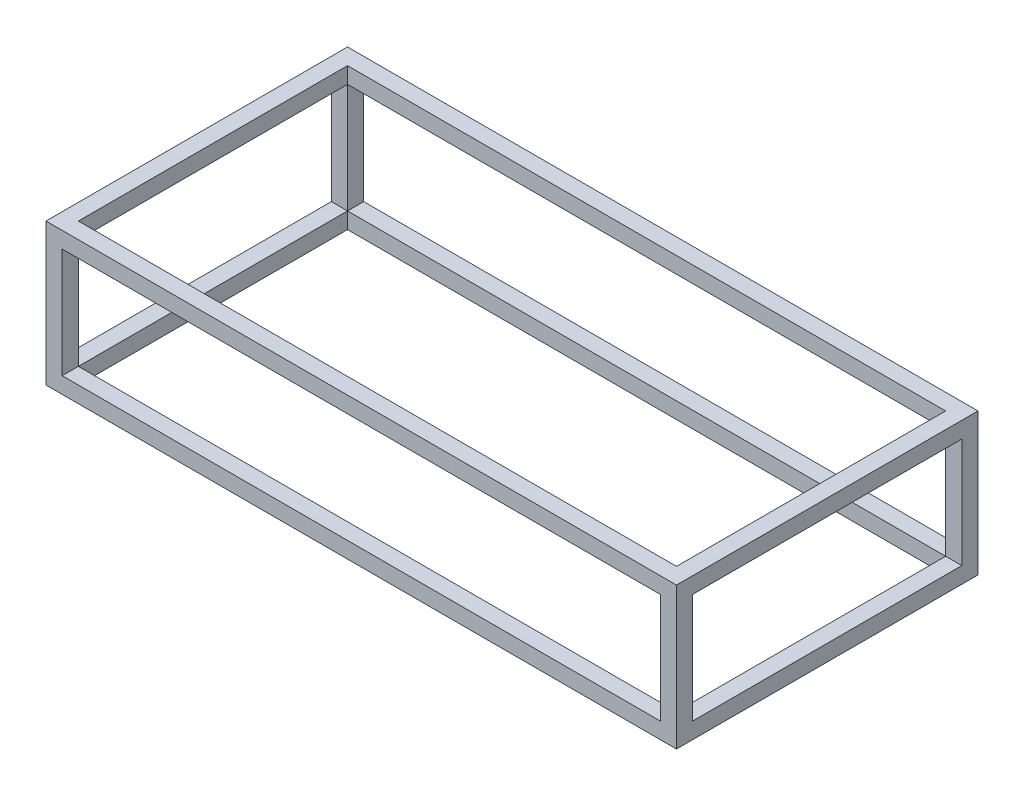
ISO-10303-21;
HEADER;
FILE_DESCRIPTION(('STEP AP214'),'2;1');
FILE_NAME('part.step','',(''),(''),'','','');
FILE_SCHEMA(('AUTOMOTIVE_DESIGN { 1 0 10303 214 1 1 1 1 }'));
ENDSEC;
DATA;
#1=APPLICATION_CONTEXT('core data for automotive mechanical design processes');
#2=APPLICATION_PROTOCOL_DEFINITION('international standard','automotive_design',2000,#1);
#3=PRODUCT_CONTEXT('',#1,'mechanical');
#4=PRODUCT('Part','Part','',(#3));
#5=PRODUCT_RELATED_PRODUCT_CATEGORY('part','',(#4));
#6=PRODUCT_DEFINITION_FORMATION('','',#4);
#7=PRODUCT_DEFINITION_CONTEXT('part definition',#1,'design');
#8=PRODUCT_DEFINITION('design','',#6,#7);
#9=PRODUCT_DEFINITION_SHAPE('','',#8);
#10=(LENGTH_UNIT() NAMED_UNIT(*) SI_UNIT(.MILLI.,.METRE.));
#11=(NAMED_UNIT(*) PLANE_ANGLE_UNIT() SI_UNIT($,.RADIAN.));
#12=(NAMED_UNIT(*) SI_UNIT($,.STERADIAN.) SOLID_ANGLE_UNIT());
#13=UNCERTAINTY_MEASURE_WITH_UNIT(LENGTH_MEASURE(1.E-05),#10,'distance_accuracy_value','');
#14=(GEOMETRIC_REPRESENTATION_CONTEXT(3) GLOBAL_UNCERTAINTY_ASSIGNED_CONTEXT((#13)) GLOBAL_UNIT_ASSIGNED_CONTEXT((#10,
#11,#12)) REPRESENTATION_CONTEXT('',''));
#15=CARTESIAN_POINT('',(0.,0.,0.));
#16=DIRECTION('',(0.,0.,1.));
#17=DIRECTION('',(1.,0.,0.));
#18=AXIS2_PLACEMENT_3D('',#15,#16,#17);
#19=CARTESIAN_POINT('',(0.,15.,0.));
#20=DIRECTION('',(0.,1.,0.));
#21=DIRECTION('',(0.,0.,1.));
#22=AXIS2_PLACEMENT_3D('',#19,#20,#21);
#23=PLANE('',#22);
#24=DIRECTION('',(-1.,0.,0.));
#25=VECTOR('',#24,1.);
#26=CARTESIAN_POINT('',(-277.1,15.,-124.7));
#27=LINE('',#26,#25);
#28=CARTESIAN_POINT('',(277.1,15.,-124.7));
#29=VERTEX_POINT('',#28);
#30=CARTESIAN_POINT('',(-277.1,15.,-124.7));
#31=VERTEX_POINT('',#30);
#32=EDGE_CURVE('E324',#29,#31,#27,.T.);
#33=ORIENTED_EDGE('',*,*,#32,.F.);
#34=DIRECTION('',(0.,0.,1.));
#35=VECTOR('',#34,1.);
#36=CARTESIAN_POINT('',(277.1,15.,-139.7));
#37=LINE('',#36,#35);
#38=CARTESIAN_POINT('',(277.1,15.,-139.7));
#39=VERTEX_POINT('',#38);
#40=EDGE_CURVE('E229',#39,#29,#37,.T.);
#41=ORIENTED_EDGE('',*,*,#40,.F.);
#42=DIRECTION('',(-1.,0.,0.));
#43=VECTOR('',#42,1.);
#44=CARTESIAN_POINT('',(-292.1,15.,-139.7));
#45=LINE('',#44,#43);
#46=CARTESIAN_POINT('',(-277.1,15.,-139.7));
#47=VERTEX_POINT('',#46);
#48=EDGE_CURVE('E356',#39,#47,#45,.T.);
#49=ORIENTED_EDGE('',*,*,#48,.T.);
#50=DIRECTION('',(0.,0.,-1.));
#51=VECTOR('',#50,1.);
#52=CARTESIAN_POINT('',(-277.1,15.,-139.7));
#53=LINE('',#52,#51);
#54=EDGE_CURVE('E304',#31,#47,#53,.T.);
#55=ORIENTED_EDGE('',*,*,#54,.F.);
#56=EDGE_LOOP('',(#33,#41,#49,#55));
#57=FACE_BOUND('',#56,.T.);
#58=ADVANCED_FACE('F33',(#57),#23,.T.);
#59=DIRECTION('',(0.,0.,-1.));
#60=VECTOR('',#59,1.);
#61=CARTESIAN_POINT('',(292.1,15.,-139.7));
#62=LINE('',#61,#60);
#63=CARTESIAN_POINT('',(292.1,15.,124.7));
#64=VERTEX_POINT('',#63);
#65=CARTESIAN_POINT('',(292.1,15.,-124.7));
#66=VERTEX_POINT('',#65);
#67=EDGE_CURVE('E48',#64,#66,#62,.T.);
#68=ORIENTED_EDGE('',*,*,#67,.T.);
#69=DIRECTION('',(1.,0.,0.));
#70=VECTOR('',#69,1.);
#71=CARTESIAN_POINT('',(292.1,15.,-124.7));
#72=LINE('',#71,#70);
#73=EDGE_CURVE('E244',#29,#66,#72,.T.);
#74=ORIENTED_EDGE('',*,*,#73,.F.);
#75=DIRECTION('',(0.,0.,-1.));
#76=VECTOR('',#75,1.);
#77=CARTESIAN_POINT('',(277.1,15.,-124.7));
#78=LINE('',#77,#76);
#79=CARTESIAN_POINT('',(277.1,15.,124.7));
#80=VERTEX_POINT('',#79);
#81=EDGE_CURVE('E321',#80,#29,#78,.T.);
#82=ORIENTED_EDGE('',*,*,#81,.F.);
#83=DIRECTION('',(-1.,0.,0.));
#84=VECTOR('',#83,1.);
#85=CARTESIAN_POINT('',(292.1,15.,124.7));
#86=LINE('',#85,#84);
#87=EDGE_CURVE('E53',#64,#80,#86,.T.);
#88=ORIENTED_EDGE('',*,*,#87,.F.);
#89=EDGE_LOOP('',(#68,#74,#82,#88));
#90=FACE_BOUND('',#89,.T.);
#91=ADVANCED_FACE('F466',(#90),#23,.T.);
#92=DIRECTION('',(1.,0.,0.));
#93=VECTOR('',#92,1.);
#94=CARTESIAN_POINT('',(-292.1,15.,139.7));
#95=LINE('',#94,#93);
#96=CARTESIAN_POINT('',(-277.1,15.,139.7));
#97=VERTEX_POINT('',#96);
#98=CARTESIAN_POINT('',(277.1,15.,139.7));
#99=VERTEX_POINT('',#98);
#100=EDGE_CURVE('E361',#97,#99,#95,.T.);
#101=ORIENTED_EDGE('',*,*,#100,.T.);
#102=DIRECTION('',(0.,0.,1.));
#103=VECTOR('',#102,1.);
#104=CARTESIAN_POINT('',(277.1,15.,139.7));
#105=LINE('',#104,#103);
#106=EDGE_CURVE('E263',#80,#99,#105,.T.);
#107=ORIENTED_EDGE('',*,*,#106,.F.);
#108=DIRECTION('',(1.,0.,0.));
#109=VECTOR('',#108,1.);
#110=CARTESIAN_POINT('',(-277.1,15.,124.7));
#111=LINE('',#110,#109);
#112=CARTESIAN_POINT('',(-277.1,15.,124.7));
#113=VERTEX_POINT('',#112);
#114=EDGE_CURVE('E331',#113,#80,#111,.T.);
#115=ORIENTED_EDGE('',*,*,#114,.F.);
#116=DIRECTION('',(0.,0.,-1.));
#117=VECTOR('',#116,1.);
#118=CARTESIAN_POINT('',(-277.1,15.,139.7));
#119=LINE('',#118,#117);
#120=EDGE_CURVE('E278',#97,#113,#119,.T.);
#121=ORIENTED_EDGE('',*,*,#120,.F.);
#122=EDGE_LOOP('',(#101,#107,#115,#121));
#123=FACE_BOUND('',#122,.T.);
#124=ADVANCED_FACE('F427',(#123),#23,.T.);
#125=DIRECTION('',(0.,0.,1.));
#126=VECTOR('',#125,1.);
#127=CARTESIAN_POINT('',(-292.1,15.,-139.7));
#128=LINE('',#127,#126);
#129=CARTESIAN_POINT('',(-292.1,15.,-124.7));
#130=VERTEX_POINT('',#129);
#131=CARTESIAN_POINT('',(-292.1,15.,124.7));
#132=VERTEX_POINT('',#131);
#133=EDGE_CURVE('E359',#130,#132,#128,.T.);
#134=ORIENTED_EDGE('',*,*,#133,.T.);
#135=DIRECTION('',(-1.,0.,0.));
#136=VECTOR('',#135,1.);
#137=CARTESIAN_POINT('',(-292.1,15.,124.7));
#138=LINE('',#137,#136);
#139=EDGE_CURVE('E283',#113,#132,#138,.T.);
#140=ORIENTED_EDGE('',*,*,#139,.F.);
#141=DIRECTION('',(0.,0.,1.));
#142=VECTOR('',#141,1.);
#143=CARTESIAN_POINT('',(-277.1,15.,-124.7));
#144=LINE('',#143,#142);
#145=EDGE_CURVE('E328',#31,#113,#144,.T.);
#146=ORIENTED_EDGE('',*,*,#145,.F.);
#147=DIRECTION('',(1.,0.,0.));
#148=VECTOR('',#147,1.);
#149=CARTESIAN_POINT('',(-292.1,15.,-124.7));
#150=LINE('',#149,#148);
#151=EDGE_CURVE('E299',#130,#31,#150,.T.);
#152=ORIENTED_EDGE('',*,*,#151,.F.);
#153=EDGE_LOOP('',(#134,#140,#146,#152));
#154=FACE_BOUND('',#153,.T.);
#155=ADVANCED_FACE('F434',(#154),#23,.T.);
#156=CARTESIAN_POINT('',(0.,0.,0.));
#157=DIRECTION('',(0.,1.,0.));
#158=DIRECTION('',(0.,0.,1.));
#159=AXIS2_PLACEMENT_3D('',#156,#157,#158);
#160=PLANE('',#159);
#161=DIRECTION('',(0.,0.,-1.));
#162=VECTOR('',#161,1.);
#163=CARTESIAN_POINT('',(292.1,0.,-139.7));
#164=LINE('',#163,#162);
#165=CARTESIAN_POINT('',(292.1,0.,139.7));
#166=VERTEX_POINT('',#165);
#167=CARTESIAN_POINT('',(292.1,0.,-139.7));
#168=VERTEX_POINT('',#167);
#169=EDGE_CURVE('E354',#166,#168,#164,.T.);
#170=ORIENTED_EDGE('',*,*,#169,.F.);
#171=DIRECTION('',(1.,0.,0.));
#172=VECTOR('',#171,1.);
#173=CARTESIAN_POINT('',(-292.1,0.,139.7));
#174=LINE('',#173,#172);
#175=CARTESIAN_POINT('',(-292.1,0.,139.7));
#176=VERTEX_POINT('',#175);
#177=EDGE_CURVE('E357',#176,#166,#174,.T.);
#178=ORIENTED_EDGE('',*,*,#177,.F.);
#179=DIRECTION('',(0.,0.,1.));
#180=VECTOR('',#179,1.);
#181=CARTESIAN_POINT('',(-292.1,0.,-139.7));
#182=LINE('',#181,#180);
#183=CARTESIAN_POINT('',(-292.1,0.,-139.7));
#184=VERTEX_POINT('',#183);
#185=EDGE_CURVE('E368',#184,#176,#182,.T.);
#186=ORIENTED_EDGE('',*,*,#185,.F.);
#187=DIRECTION('',(-1.,0.,0.));
#188=VECTOR('',#187,1.);
#189=CARTESIAN_POINT('',(-292.1,0.,-139.7));
#190=LINE('',#189,#188);
#191=EDGE_CURVE('E366',#168,#184,#190,.T.);
#192=ORIENTED_EDGE('',*,*,#191,.F.);
#193=EDGE_LOOP('',(#170,#178,#186,#192));
#194=FACE_BOUND('',#193,.T.);
#195=DIRECTION('',(0.,0.,-1.));
#196=VECTOR('',#195,1.);
#197=CARTESIAN_POINT('',(277.1,0.,-124.7));
#198=LINE('',#197,#196);
#199=CARTESIAN_POINT('',(277.1,0.,124.7));
#200=VERTEX_POINT('',#199);
#201=CARTESIAN_POINT('',(277.1,0.,-124.7));
#202=VERTEX_POINT('',#201);
#203=EDGE_CURVE('E320',#200,#202,#198,.T.);
#204=ORIENTED_EDGE('',*,*,#203,.T.);
#205=DIRECTION('',(-1.,0.,0.));
#206=VECTOR('',#205,1.);
#207=CARTESIAN_POINT('',(-277.1,0.,-124.7));
#208=LINE('',#207,#206);
#209=CARTESIAN_POINT('',(-277.1,0.,-124.7));
#210=VERTEX_POINT('',#209);
#211=EDGE_CURVE('E337',#202,#210,#208,.T.);
#212=ORIENTED_EDGE('',*,*,#211,.T.);
#213=DIRECTION('',(0.,0.,1.));
#214=VECTOR('',#213,1.);
#215=CARTESIAN_POINT('',(-277.1,0.,-124.7));
#216=LINE('',#215,#214);
#217=CARTESIAN_POINT('',(-277.1,0.,124.7));
#218=VERTEX_POINT('',#217);
#219=EDGE_CURVE('E340',#210,#218,#216,.T.);
#220=ORIENTED_EDGE('',*,*,#219,.T.);
#221=DIRECTION('',(1.,0.,0.));
#222=VECTOR('',#221,1.);
#223=CARTESIAN_POINT('',(-277.1,0.,124.7));
#224=LINE('',#223,#222);
#225=EDGE_CURVE('E325',#218,#200,#224,.T.);
#226=ORIENTED_EDGE('',*,*,#225,.T.);
#227=EDGE_LOOP('',(#204,#212,#220,#226));
#228=FACE_BOUND('',#227,.T.);
#229=ADVANCED_FACE('F385',(#194,#228),#160,.F.);
#230=CARTESIAN_POINT('',(292.1,15.,-139.7));
#231=DIRECTION('',(-1.,0.,0.));
#232=DIRECTION('',(0.,0.,1.));
#233=AXIS2_PLACEMENT_3D('',#230,#231,#232);
#234=PLANE('',#233);
#235=DIRECTION('',(0.,-1.,0.));
#236=VECTOR('',#235,1.);
#237=CARTESIAN_POINT('',(292.1,116.6,124.7));
#238=LINE('',#237,#236);
#239=CARTESIAN_POINT('',(292.1,116.6,124.7));
#240=VERTEX_POINT('',#239);
#241=EDGE_CURVE('E275',#240,#64,#238,.T.);
#242=ORIENTED_EDGE('',*,*,#241,.F.);
#243=DIRECTION('',(0.,0.,-1.));
#244=VECTOR('',#243,1.);
#245=CARTESIAN_POINT('',(292.1,116.6,-139.7));
#246=LINE('',#245,#244);
#247=CARTESIAN_POINT('',(292.1,116.6,-124.7));
#248=VERTEX_POINT('',#247);
#249=EDGE_CURVE('E235',#240,#248,#246,.T.);
#250=ORIENTED_EDGE('',*,*,#249,.T.);
#251=DIRECTION('',(0.,-1.,0.));
#252=VECTOR('',#251,1.);
#253=CARTESIAN_POINT('',(292.1,116.6,-124.7));
#254=LINE('',#253,#252);
#255=EDGE_CURVE('E247',#248,#66,#254,.T.);
#256=ORIENTED_EDGE('',*,*,#255,.T.);
#257=ORIENTED_EDGE('',*,*,#67,.F.);
#258=EDGE_LOOP('',(#242,#250,#256,#257));
#259=FACE_BOUND('',#258,.T.);
#260=ORIENTED_EDGE('',*,*,#169,.T.);
#261=DIRECTION('',(0.,-1.,0.));
#262=VECTOR('',#261,1.);
#263=CARTESIAN_POINT('',(292.1,15.,-139.7));
#264=LINE('',#263,#262);
#265=CARTESIAN_POINT('',(292.1,131.6,-139.7));
#266=VERTEX_POINT('',#265);
#267=EDGE_CURVE('E11',#266,#168,#264,.T.);
#268=ORIENTED_EDGE('',*,*,#267,.F.);
#269=DIRECTION('',(0.,0.,-1.));
#270=VECTOR('',#269,1.);
#271=CARTESIAN_POINT('',(292.1,131.6,-139.7));
#272=LINE('',#271,#270);
#273=CARTESIAN_POINT('',(292.1,131.6,139.7));
#274=VERTEX_POINT('',#273);
#275=EDGE_CURVE('E223',#274,#266,#272,.T.);
#276=ORIENTED_EDGE('',*,*,#275,.F.);
#277=DIRECTION('',(0.,-1.,0.));
#278=VECTOR('',#277,1.);
#279=CARTESIAN_POINT('',(292.1,15.,139.7));
#280=LINE('',#279,#278);
#281=EDGE_CURVE('E363',#274,#166,#280,.T.);
#282=ORIENTED_EDGE('',*,*,#281,.T.);
#283=EDGE_LOOP('',(#260,#268,#276,#282));
#284=FACE_BOUND('',#283,.T.);
#285=ADVANCED_FACE('F35',(#259,#284),#234,.F.);
#286=CARTESIAN_POINT('',(-292.1,15.,-139.7));
#287=DIRECTION('',(0.,0.,1.));
#288=DIRECTION('',(1.,0.,0.));
#289=AXIS2_PLACEMENT_3D('',#286,#287,#288);
#290=PLANE('',#289);
#291=DIRECTION('',(0.,-1.,0.));
#292=VECTOR('',#291,1.);
#293=CARTESIAN_POINT('',(-292.1,15.,-139.7));
#294=LINE('',#293,#292);
#295=CARTESIAN_POINT('',(-292.1,131.6,-139.7));
#296=VERTEX_POINT('',#295);
#297=EDGE_CURVE('E41',#296,#184,#294,.T.);
#298=ORIENTED_EDGE('',*,*,#297,.F.);
#299=DIRECTION('',(-1.,0.,0.));
#300=VECTOR('',#299,1.);
#301=CARTESIAN_POINT('',(-292.1,131.6,-139.7));
#302=LINE('',#301,#300);
#303=EDGE_CURVE('E226',#266,#296,#302,.T.);
#304=ORIENTED_EDGE('',*,*,#303,.F.);
#305=ORIENTED_EDGE('',*,*,#267,.T.);
#306=ORIENTED_EDGE('',*,*,#191,.T.);
#307=EDGE_LOOP('',(#298,#304,#305,#306));
#308=FACE_BOUND('',#307,.T.);
#309=DIRECTION('',(-1.,0.,0.));
#310=VECTOR('',#309,1.);
#311=CARTESIAN_POINT('',(-292.1,116.6,-139.7));
#312=LINE('',#311,#310);
#313=CARTESIAN_POINT('',(277.1,116.6,-139.7));
#314=VERTEX_POINT('',#313);
#315=CARTESIAN_POINT('',(-277.1,116.6,-139.7));
#316=VERTEX_POINT('',#315);
#317=EDGE_CURVE('E220',#314,#316,#312,.T.);
#318=ORIENTED_EDGE('',*,*,#317,.T.);
#319=DIRECTION('',(0.,-1.,0.));
#320=VECTOR('',#319,1.);
#321=CARTESIAN_POINT('',(-277.1,116.6,-139.7));
#322=LINE('',#321,#320);
#323=EDGE_CURVE('E307',#316,#47,#322,.T.);
#324=ORIENTED_EDGE('',*,*,#323,.T.);
#325=ORIENTED_EDGE('',*,*,#48,.F.);
#326=DIRECTION('',(0.,-1.,0.));
#327=VECTOR('',#326,1.);
#328=CARTESIAN_POINT('',(277.1,116.6,-139.7));
#329=LINE('',#328,#327);
#330=EDGE_CURVE('E256',#314,#39,#329,.T.);
#331=ORIENTED_EDGE('',*,*,#330,.F.);
#332=EDGE_LOOP('',(#318,#324,#325,#331));
#333=FACE_BOUND('',#332,.T.);
#334=ADVANCED_FACE('F393',(#308,#333),#290,.F.);
#335=CARTESIAN_POINT('',(-292.1,15.,-139.7));
#336=DIRECTION('',(1.,0.,0.));
#337=DIRECTION('',(0.,0.,-1.));
#338=AXIS2_PLACEMENT_3D('',#335,#336,#337);
#339=PLANE('',#338);
#340=DIRECTION('',(0.,-1.,0.));
#341=VECTOR('',#340,1.);
#342=CARTESIAN_POINT('',(-292.1,116.6,-124.7));
#343=LINE('',#342,#341);
#344=CARTESIAN_POINT('',(-292.1,116.6,-124.7));
#345=VERTEX_POINT('',#344);
#346=EDGE_CURVE('E317',#345,#130,#343,.T.);
#347=ORIENTED_EDGE('',*,*,#346,.F.);
#348=DIRECTION('',(0.,0.,1.));
#349=VECTOR('',#348,1.);
#350=CARTESIAN_POINT('',(-292.1,116.6,-139.7));
#351=LINE('',#350,#349);
#352=CARTESIAN_POINT('',(-292.1,116.6,124.7));
#353=VERTEX_POINT('',#352);
#354=EDGE_CURVE('E191',#345,#353,#351,.T.);
#355=ORIENTED_EDGE('',*,*,#354,.T.);
#356=DIRECTION('',(0.,-1.,0.));
#357=VECTOR('',#356,1.);
#358=CARTESIAN_POINT('',(-292.1,116.6,124.7));
#359=LINE('',#358,#357);
#360=EDGE_CURVE('E286',#353,#132,#359,.T.);
#361=ORIENTED_EDGE('',*,*,#360,.T.);
#362=ORIENTED_EDGE('',*,*,#133,.F.);
#363=EDGE_LOOP('',(#347,#355,#361,#362));
#364=FACE_BOUND('',#363,.T.);
#365=ORIENTED_EDGE('',*,*,#185,.T.);
#366=DIRECTION('',(0.,-1.,0.));
#367=VECTOR('',#366,1.);
#368=CARTESIAN_POINT('',(-292.1,15.,139.7));
#369=LINE('',#368,#367);
#370=CARTESIAN_POINT('',(-292.1,131.6,139.7));
#371=VERTEX_POINT('',#370);
#372=EDGE_CURVE('E373',#371,#176,#369,.T.);
#373=ORIENTED_EDGE('',*,*,#372,.F.);
#374=DIRECTION('',(0.,0.,1.));
#375=VECTOR('',#374,1.);
#376=CARTESIAN_POINT('',(-292.1,131.6,-139.7));
#377=LINE('',#376,#375);
#378=EDGE_CURVE('E216',#296,#371,#377,.T.);
#379=ORIENTED_EDGE('',*,*,#378,.F.);
#380=ORIENTED_EDGE('',*,*,#297,.T.);
#381=EDGE_LOOP('',(#365,#373,#379,#380));
#382=FACE_BOUND('',#381,.T.);
#383=ADVANCED_FACE('F379',(#364,#382),#339,.F.);
#384=CARTESIAN_POINT('',(-292.1,15.,139.7));
#385=DIRECTION('',(0.,0.,-1.));
#386=DIRECTION('',(-1.,0.,0.));
#387=AXIS2_PLACEMENT_3D('',#384,#385,#386);
#388=PLANE('',#387);
#389=DIRECTION('',(0.,-1.,0.));
#390=VECTOR('',#389,1.);
#391=CARTESIAN_POINT('',(-277.1,116.6,139.7));
#392=LINE('',#391,#390);
#393=CARTESIAN_POINT('',(-277.1,116.6,139.7));
#394=VERTEX_POINT('',#393);
#395=EDGE_CURVE('E296',#394,#97,#392,.T.);
#396=ORIENTED_EDGE('',*,*,#395,.F.);
#397=DIRECTION('',(1.,0.,0.));
#398=VECTOR('',#397,1.);
#399=CARTESIAN_POINT('',(-292.1,116.6,139.7));
#400=LINE('',#399,#398);
#401=CARTESIAN_POINT('',(277.1,116.6,139.7));
#402=VERTEX_POINT('',#401);
#403=EDGE_CURVE('E232',#394,#402,#400,.T.);
#404=ORIENTED_EDGE('',*,*,#403,.T.);
#405=DIRECTION('',(0.,-1.,0.));
#406=VECTOR('',#405,1.);
#407=CARTESIAN_POINT('',(277.1,116.6,139.7));
#408=LINE('',#407,#406);
#409=EDGE_CURVE('E266',#402,#99,#408,.T.);
#410=ORIENTED_EDGE('',*,*,#409,.T.);
#411=ORIENTED_EDGE('',*,*,#100,.F.);
#412=EDGE_LOOP('',(#396,#404,#410,#411));
#413=FACE_BOUND('',#412,.T.);
#414=ORIENTED_EDGE('',*,*,#177,.T.);
#415=ORIENTED_EDGE('',*,*,#281,.F.);
#416=DIRECTION('',(1.,0.,0.));
#417=VECTOR('',#416,1.);
#418=CARTESIAN_POINT('',(-292.1,131.6,139.7));
#419=LINE('',#418,#417);
#420=EDGE_CURVE('E219',#371,#274,#419,.T.);
#421=ORIENTED_EDGE('',*,*,#420,.F.);
#422=ORIENTED_EDGE('',*,*,#372,.T.);
#423=EDGE_LOOP('',(#414,#415,#421,#422));
#424=FACE_BOUND('',#423,.T.);
#425=ADVANCED_FACE('F388',(#413,#424),#388,.F.);
#426=CARTESIAN_POINT('',(277.1,15.,-124.7));
#427=DIRECTION('',(-1.,0.,0.));
#428=DIRECTION('',(0.,0.,1.));
#429=AXIS2_PLACEMENT_3D('',#426,#427,#428);
#430=PLANE('',#429);
#431=ORIENTED_EDGE('',*,*,#203,.F.);
#432=DIRECTION('',(0.,-1.,0.));
#433=VECTOR('',#432,1.);
#434=CARTESIAN_POINT('',(277.1,15.,124.7));
#435=LINE('',#434,#433);
#436=EDGE_CURVE('E334',#80,#200,#435,.T.);
#437=ORIENTED_EDGE('',*,*,#436,.F.);
#438=ORIENTED_EDGE('',*,*,#81,.T.);
#439=DIRECTION('',(0.,-1.,0.));
#440=VECTOR('',#439,1.);
#441=CARTESIAN_POINT('',(277.1,15.,-124.7));
#442=LINE('',#441,#440);
#443=EDGE_CURVE('E351',#29,#202,#442,.T.);
#444=ORIENTED_EDGE('',*,*,#443,.T.);
#445=EDGE_LOOP('',(#431,#437,#438,#444));
#446=FACE_BOUND('',#445,.T.);
#447=ADVANCED_FACE('F465',(#446),#430,.T.);
#448=CARTESIAN_POINT('',(-277.1,15.,-124.7));
#449=DIRECTION('',(0.,0.,1.));
#450=DIRECTION('',(1.,0.,0.));
#451=AXIS2_PLACEMENT_3D('',#448,#449,#450);
#452=PLANE('',#451);
#453=ORIENTED_EDGE('',*,*,#211,.F.);
#454=ORIENTED_EDGE('',*,*,#443,.F.);
#455=ORIENTED_EDGE('',*,*,#32,.T.);
#456=DIRECTION('',(0.,-1.,0.));
#457=VECTOR('',#456,1.);
#458=CARTESIAN_POINT('',(-277.1,15.,-124.7));
#459=LINE('',#458,#457);
#460=EDGE_CURVE('E349',#31,#210,#459,.T.);
#461=ORIENTED_EDGE('',*,*,#460,.T.);
#462=EDGE_LOOP('',(#453,#454,#455,#461));
#463=FACE_BOUND('',#462,.T.);
#464=ADVANCED_FACE('F444',(#463),#452,.T.);
#465=CARTESIAN_POINT('',(-277.1,15.,-124.7));
#466=DIRECTION('',(1.,0.,0.));
#467=DIRECTION('',(0.,0.,-1.));
#468=AXIS2_PLACEMENT_3D('',#465,#466,#467);
#469=PLANE('',#468);
#470=ORIENTED_EDGE('',*,*,#219,.F.);
#471=ORIENTED_EDGE('',*,*,#460,.F.);
#472=ORIENTED_EDGE('',*,*,#145,.T.);
#473=DIRECTION('',(0.,-1.,0.));
#474=VECTOR('',#473,1.);
#475=CARTESIAN_POINT('',(-277.1,15.,124.7));
#476=LINE('',#475,#474);
#477=EDGE_CURVE('E347',#113,#218,#476,.T.);
#478=ORIENTED_EDGE('',*,*,#477,.T.);
#479=EDGE_LOOP('',(#470,#471,#472,#478));
#480=FACE_BOUND('',#479,.T.);
#481=ADVANCED_FACE('F439',(#480),#469,.T.);
#482=CARTESIAN_POINT('',(-277.1,15.,124.7));
#483=DIRECTION('',(0.,0.,-1.));
#484=DIRECTION('',(-1.,0.,0.));
#485=AXIS2_PLACEMENT_3D('',#482,#483,#484);
#486=PLANE('',#485);
#487=ORIENTED_EDGE('',*,*,#225,.F.);
#488=ORIENTED_EDGE('',*,*,#477,.F.);
#489=ORIENTED_EDGE('',*,*,#114,.T.);
#490=ORIENTED_EDGE('',*,*,#436,.T.);
#491=EDGE_LOOP('',(#487,#488,#489,#490));
#492=FACE_BOUND('',#491,.T.);
#493=ADVANCED_FACE('F463',(#492),#486,.T.);
#494=CARTESIAN_POINT('',(-292.1,116.6,-124.7));
#495=DIRECTION('',(0.,0.,-1.));
#496=DIRECTION('',(-1.,0.,0.));
#497=AXIS2_PLACEMENT_3D('',#494,#495,#496);
#498=PLANE('',#497);
#499=ORIENTED_EDGE('',*,*,#151,.T.);
#500=DIRECTION('',(0.,-1.,0.));
#501=VECTOR('',#500,1.);
#502=CARTESIAN_POINT('',(-277.1,116.6,-124.7));
#503=LINE('',#502,#501);
#504=CARTESIAN_POINT('',(-277.1,116.6,-124.7));
#505=VERTEX_POINT('',#504);
#506=EDGE_CURVE('E314',#505,#31,#503,.T.);
#507=ORIENTED_EDGE('',*,*,#506,.F.);
#508=DIRECTION('',(1.,0.,0.));
#509=VECTOR('',#508,1.);
#510=CARTESIAN_POINT('',(-292.1,116.6,-124.7));
#511=LINE('',#510,#509);
#512=EDGE_CURVE('E300',#345,#505,#511,.T.);
#513=ORIENTED_EDGE('',*,*,#512,.F.);
#514=ORIENTED_EDGE('',*,*,#346,.T.);
#515=EDGE_LOOP('',(#499,#507,#513,#514));
#516=FACE_BOUND('',#515,.T.);
#517=ADVANCED_FACE('F432',(#516),#498,.F.);
#518=CARTESIAN_POINT('',(-277.1,116.6,-139.7));
#519=DIRECTION('',(-1.,0.,0.));
#520=DIRECTION('',(0.,0.,1.));
#521=AXIS2_PLACEMENT_3D('',#518,#519,#520);
#522=PLANE('',#521);
#523=ORIENTED_EDGE('',*,*,#54,.T.);
#524=ORIENTED_EDGE('',*,*,#323,.F.);
#525=DIRECTION('',(0.,0.,-1.));
#526=VECTOR('',#525,1.);
#527=CARTESIAN_POINT('',(-277.1,116.6,-139.7));
#528=LINE('',#527,#526);
#529=EDGE_CURVE('E303',#505,#316,#528,.T.);
#530=ORIENTED_EDGE('',*,*,#529,.F.);
#531=ORIENTED_EDGE('',*,*,#506,.T.);
#532=EDGE_LOOP('',(#523,#524,#530,#531));
#533=FACE_BOUND('',#532,.T.);
#534=ADVANCED_FACE('F403',(#533),#522,.F.);
#535=CARTESIAN_POINT('',(-277.1,116.6,139.7));
#536=DIRECTION('',(-1.,0.,0.));
#537=DIRECTION('',(0.,0.,1.));
#538=AXIS2_PLACEMENT_3D('',#535,#536,#537);
#539=PLANE('',#538);
#540=ORIENTED_EDGE('',*,*,#120,.T.);
#541=DIRECTION('',(0.,-1.,0.));
#542=VECTOR('',#541,1.);
#543=CARTESIAN_POINT('',(-277.1,116.6,124.7));
#544=LINE('',#543,#542);
#545=CARTESIAN_POINT('',(-277.1,116.6,124.7));
#546=VERTEX_POINT('',#545);
#547=EDGE_CURVE('E293',#546,#113,#544,.T.);
#548=ORIENTED_EDGE('',*,*,#547,.F.);
#549=DIRECTION('',(0.,0.,-1.));
#550=VECTOR('',#549,1.);
#551=CARTESIAN_POINT('',(-277.1,116.6,139.7));
#552=LINE('',#551,#550);
#553=EDGE_CURVE('E279',#394,#546,#552,.T.);
#554=ORIENTED_EDGE('',*,*,#553,.F.);
#555=ORIENTED_EDGE('',*,*,#395,.T.);
#556=EDGE_LOOP('',(#540,#548,#554,#555));
#557=FACE_BOUND('',#556,.T.);
#558=ADVANCED_FACE('F421',(#557),#539,.F.);
#559=CARTESIAN_POINT('',(-292.1,116.6,124.7));
#560=DIRECTION('',(0.,0.,1.));
#561=DIRECTION('',(1.,0.,0.));
#562=AXIS2_PLACEMENT_3D('',#559,#560,#561);
#563=PLANE('',#562);
#564=ORIENTED_EDGE('',*,*,#139,.T.);
#565=ORIENTED_EDGE('',*,*,#360,.F.);
#566=DIRECTION('',(-1.,0.,0.));
#567=VECTOR('',#566,1.);
#568=CARTESIAN_POINT('',(-292.1,116.6,124.7));
#569=LINE('',#568,#567);
#570=EDGE_CURVE('E282',#546,#353,#569,.T.);
#571=ORIENTED_EDGE('',*,*,#570,.F.);
#572=ORIENTED_EDGE('',*,*,#547,.T.);
#573=EDGE_LOOP('',(#564,#565,#571,#572));
#574=FACE_BOUND('',#573,.T.);
#575=ADVANCED_FACE('F429',(#574),#563,.F.);
#576=CARTESIAN_POINT('',(292.1,116.6,124.7));
#577=DIRECTION('',(0.,0.,1.));
#578=DIRECTION('',(1.,0.,0.));
#579=AXIS2_PLACEMENT_3D('',#576,#577,#578);
#580=PLANE('',#579);
#581=ORIENTED_EDGE('',*,*,#87,.T.);
#582=DIRECTION('',(0.,-1.,0.));
#583=VECTOR('',#582,1.);
#584=CARTESIAN_POINT('',(277.1,116.6,124.7));
#585=LINE('',#584,#583);
#586=CARTESIAN_POINT('',(277.1,116.6,124.7));
#587=VERTEX_POINT('',#586);
#588=EDGE_CURVE('E272',#587,#80,#585,.T.);
#589=ORIENTED_EDGE('',*,*,#588,.F.);
#590=DIRECTION('',(-1.,0.,0.));
#591=VECTOR('',#590,1.);
#592=CARTESIAN_POINT('',(292.1,116.6,124.7));
#593=LINE('',#592,#591);
#594=EDGE_CURVE('E259',#240,#587,#593,.T.);
#595=ORIENTED_EDGE('',*,*,#594,.F.);
#596=ORIENTED_EDGE('',*,*,#241,.T.);
#597=EDGE_LOOP('',(#581,#589,#595,#596));
#598=FACE_BOUND('',#597,.T.);
#599=ADVANCED_FACE('F457',(#598),#580,.F.);
#600=CARTESIAN_POINT('',(277.1,116.6,139.7));
#601=DIRECTION('',(1.,0.,0.));
#602=DIRECTION('',(0.,0.,-1.));
#603=AXIS2_PLACEMENT_3D('',#600,#601,#602);
#604=PLANE('',#603);
#605=ORIENTED_EDGE('',*,*,#106,.T.);
#606=ORIENTED_EDGE('',*,*,#409,.F.);
#607=DIRECTION('',(0.,0.,1.));
#608=VECTOR('',#607,1.);
#609=CARTESIAN_POINT('',(277.1,116.6,139.7));
#610=LINE('',#609,#608);
#611=EDGE_CURVE('E262',#587,#402,#610,.T.);
#612=ORIENTED_EDGE('',*,*,#611,.F.);
#613=ORIENTED_EDGE('',*,*,#588,.T.);
#614=EDGE_LOOP('',(#605,#606,#612,#613));
#615=FACE_BOUND('',#614,.T.);
#616=ADVANCED_FACE('F459',(#615),#604,.F.);
#617=CARTESIAN_POINT('',(277.1,116.6,-139.7));
#618=DIRECTION('',(1.,0.,0.));
#619=DIRECTION('',(0.,0.,-1.));
#620=AXIS2_PLACEMENT_3D('',#617,#618,#619);
#621=PLANE('',#620);
#622=ORIENTED_EDGE('',*,*,#40,.T.);
#623=DIRECTION('',(0.,-1.,0.));
#624=VECTOR('',#623,1.);
#625=CARTESIAN_POINT('',(277.1,116.6,-124.7));
#626=LINE('',#625,#624);
#627=CARTESIAN_POINT('',(277.1,116.6,-124.7));
#628=VERTEX_POINT('',#627);
#629=EDGE_CURVE('E253',#628,#29,#626,.T.);
#630=ORIENTED_EDGE('',*,*,#629,.F.);
#631=DIRECTION('',(0.,0.,1.));
#632=VECTOR('',#631,1.);
#633=CARTESIAN_POINT('',(277.1,116.6,-139.7));
#634=LINE('',#633,#632);
#635=EDGE_CURVE('E240',#314,#628,#634,.T.);
#636=ORIENTED_EDGE('',*,*,#635,.F.);
#637=ORIENTED_EDGE('',*,*,#330,.T.);
#638=EDGE_LOOP('',(#622,#630,#636,#637));
#639=FACE_BOUND('',#638,.T.);
#640=ADVANCED_FACE('F448',(#639),#621,.F.);
#641=CARTESIAN_POINT('',(292.1,116.6,-124.7));
#642=DIRECTION('',(0.,0.,-1.));
#643=DIRECTION('',(-1.,0.,0.));
#644=AXIS2_PLACEMENT_3D('',#641,#642,#643);
#645=PLANE('',#644);
#646=ORIENTED_EDGE('',*,*,#73,.T.);
#647=ORIENTED_EDGE('',*,*,#255,.F.);
#648=DIRECTION('',(1.,0.,0.));
#649=VECTOR('',#648,1.);
#650=CARTESIAN_POINT('',(292.1,116.6,-124.7));
#651=LINE('',#650,#649);
#652=EDGE_CURVE('E243',#628,#248,#651,.T.);
#653=ORIENTED_EDGE('',*,*,#652,.F.);
#654=ORIENTED_EDGE('',*,*,#629,.T.);
#655=EDGE_LOOP('',(#646,#647,#653,#654));
#656=FACE_BOUND('',#655,.T.);
#657=ADVANCED_FACE('F451',(#656),#645,.F.);
#658=CARTESIAN_POINT('',(0.,116.6,0.));
#659=DIRECTION('',(0.,1.,0.));
#660=DIRECTION('',(0.,0.,1.));
#661=AXIS2_PLACEMENT_3D('',#658,#659,#660);
#662=PLANE('',#661);
#663=ORIENTED_EDGE('',*,*,#354,.F.);
#664=ORIENTED_EDGE('',*,*,#512,.T.);
#665=DIRECTION('',(0.,0.,1.));
#666=VECTOR('',#665,1.);
#667=CARTESIAN_POINT('',(-277.1,116.6,-124.7));
#668=LINE('',#667,#666);
#669=EDGE_CURVE('E203',#505,#546,#668,.T.);
#670=ORIENTED_EDGE('',*,*,#669,.T.);
#671=ORIENTED_EDGE('',*,*,#570,.T.);
#672=EDGE_LOOP('',(#663,#664,#670,#671));
#673=FACE_BOUND('',#672,.T.);
#674=ADVANCED_FACE('F406',(#673),#662,.F.);
#675=DIRECTION('',(-1.,0.,0.));
#676=VECTOR('',#675,1.);
#677=CARTESIAN_POINT('',(-277.1,116.6,-124.7));
#678=LINE('',#677,#676);
#679=EDGE_CURVE('E182',#628,#505,#678,.T.);
#680=ORIENTED_EDGE('',*,*,#679,.T.);
#681=ORIENTED_EDGE('',*,*,#529,.T.);
#682=ORIENTED_EDGE('',*,*,#317,.F.);
#683=ORIENTED_EDGE('',*,*,#635,.T.);
#684=EDGE_LOOP('',(#680,#681,#682,#683));
#685=FACE_BOUND('',#684,.T.);
#686=ADVANCED_FACE('F399',(#685),#662,.F.);
#687=ORIENTED_EDGE('',*,*,#403,.F.);
#688=ORIENTED_EDGE('',*,*,#553,.T.);
#689=DIRECTION('',(1.,0.,0.));
#690=VECTOR('',#689,1.);
#691=CARTESIAN_POINT('',(-277.1,116.6,124.7));
#692=LINE('',#691,#690);
#693=EDGE_CURVE('E190',#546,#587,#692,.T.);
#694=ORIENTED_EDGE('',*,*,#693,.T.);
#695=ORIENTED_EDGE('',*,*,#611,.T.);
#696=EDGE_LOOP('',(#687,#688,#694,#695));
#697=FACE_BOUND('',#696,.T.);
#698=ADVANCED_FACE('F417',(#697),#662,.F.);
#699=ORIENTED_EDGE('',*,*,#249,.F.);
#700=ORIENTED_EDGE('',*,*,#594,.T.);
#701=DIRECTION('',(0.,0.,-1.));
#702=VECTOR('',#701,1.);
#703=CARTESIAN_POINT('',(277.1,116.6,-124.7));
#704=LINE('',#703,#702);
#705=EDGE_CURVE('E206',#587,#628,#704,.T.);
#706=ORIENTED_EDGE('',*,*,#705,.T.);
#707=ORIENTED_EDGE('',*,*,#652,.T.);
#708=EDGE_LOOP('',(#699,#700,#706,#707));
#709=FACE_BOUND('',#708,.T.);
#710=ADVANCED_FACE('F453',(#709),#662,.F.);
#711=CARTESIAN_POINT('',(0.,131.6,0.));
#712=DIRECTION('',(0.,1.,0.));
#713=DIRECTION('',(0.,0.,1.));
#714=AXIS2_PLACEMENT_3D('',#711,#712,#713);
#715=PLANE('',#714);
#716=ORIENTED_EDGE('',*,*,#378,.T.);
#717=ORIENTED_EDGE('',*,*,#420,.T.);
#718=ORIENTED_EDGE('',*,*,#275,.T.);
#719=ORIENTED_EDGE('',*,*,#303,.T.);
#720=EDGE_LOOP('',(#716,#717,#718,#719));
#721=FACE_BOUND('',#720,.T.);
#722=DIRECTION('',(1.,0.,0.));
#723=VECTOR('',#722,1.);
#724=CARTESIAN_POINT('',(-277.1,131.6,124.7));
#725=LINE('',#724,#723);
#726=CARTESIAN_POINT('',(-277.1,131.6,124.7));
#727=VERTEX_POINT('',#726);
#728=CARTESIAN_POINT('',(277.1,131.6,124.7));
#729=VERTEX_POINT('',#728);
#730=EDGE_CURVE('E181',#727,#729,#725,.T.);
#731=ORIENTED_EDGE('',*,*,#730,.F.);
#732=DIRECTION('',(0.,0.,1.));
#733=VECTOR('',#732,1.);
#734=CARTESIAN_POINT('',(-277.1,131.6,-124.7));
#735=LINE('',#734,#733);
#736=CARTESIAN_POINT('',(-277.1,131.6,-124.7));
#737=VERTEX_POINT('',#736);
#738=EDGE_CURVE('E170',#737,#727,#735,.T.);
#739=ORIENTED_EDGE('',*,*,#738,.F.);
#740=DIRECTION('',(-1.,0.,0.));
#741=VECTOR('',#740,1.);
#742=CARTESIAN_POINT('',(-277.1,131.6,-124.7));
#743=LINE('',#742,#741);
#744=CARTESIAN_POINT('',(277.1,131.6,-124.7));
#745=VERTEX_POINT('',#744);
#746=EDGE_CURVE('E199',#745,#737,#743,.T.);
#747=ORIENTED_EDGE('',*,*,#746,.F.);
#748=DIRECTION('',(0.,0.,-1.));
#749=VECTOR('',#748,1.);
#750=CARTESIAN_POINT('',(277.1,131.6,-124.7));
#751=LINE('',#750,#749);
#752=EDGE_CURVE('E197',#729,#745,#751,.T.);
#753=ORIENTED_EDGE('',*,*,#752,.F.);
#754=EDGE_LOOP('',(#731,#739,#747,#753));
#755=FACE_BOUND('',#754,.T.);
#756=ADVANCED_FACE('F195',(#721,#755),#715,.T.);
#757=CARTESIAN_POINT('',(-277.1,131.6,-124.7));
#758=DIRECTION('',(1.,0.,0.));
#759=DIRECTION('',(0.,0.,-1.));
#760=AXIS2_PLACEMENT_3D('',#757,#758,#759);
#761=PLANE('',#760);
#762=ORIENTED_EDGE('',*,*,#669,.F.);
#763=DIRECTION('',(0.,-1.,0.));
#764=VECTOR('',#763,1.);
#765=CARTESIAN_POINT('',(-277.1,131.6,-124.7));
#766=LINE('',#765,#764);
#767=EDGE_CURVE('E177',#737,#505,#766,.T.);
#768=ORIENTED_EDGE('',*,*,#767,.F.);
#769=ORIENTED_EDGE('',*,*,#738,.T.);
#770=DIRECTION('',(0.,-1.,0.));
#771=VECTOR('',#770,1.);
#772=CARTESIAN_POINT('',(-277.1,131.6,124.7));
#773=LINE('',#772,#771);
#774=EDGE_CURVE('E174',#727,#546,#773,.T.);
#775=ORIENTED_EDGE('',*,*,#774,.T.);
#776=EDGE_LOOP('',(#762,#768,#769,#775));
#777=FACE_BOUND('',#776,.T.);
#778=ADVANCED_FACE('F173',(#777),#761,.T.);
#779=CARTESIAN_POINT('',(-277.1,131.6,124.7));
#780=DIRECTION('',(0.,0.,-1.));
#781=DIRECTION('',(-1.,0.,0.));
#782=AXIS2_PLACEMENT_3D('',#779,#780,#781);
#783=PLANE('',#782);
#784=ORIENTED_EDGE('',*,*,#693,.F.);
#785=ORIENTED_EDGE('',*,*,#774,.F.);
#786=ORIENTED_EDGE('',*,*,#730,.T.);
#787=DIRECTION('',(0.,-1.,0.));
#788=VECTOR('',#787,1.);
#789=CARTESIAN_POINT('',(277.1,131.6,124.7));
#790=LINE('',#789,#788);
#791=EDGE_CURVE('E192',#729,#587,#790,.T.);
#792=ORIENTED_EDGE('',*,*,#791,.T.);
#793=EDGE_LOOP('',(#784,#785,#786,#792));
#794=FACE_BOUND('',#793,.T.);
#795=ADVANCED_FACE('F186',(#794),#783,.T.);
#796=CARTESIAN_POINT('',(277.1,131.6,-124.7));
#797=DIRECTION('',(-1.,0.,0.));
#798=DIRECTION('',(0.,0.,1.));
#799=AXIS2_PLACEMENT_3D('',#796,#797,#798);
#800=PLANE('',#799);
#801=ORIENTED_EDGE('',*,*,#705,.F.);
#802=ORIENTED_EDGE('',*,*,#791,.F.);
#803=ORIENTED_EDGE('',*,*,#752,.T.);
#804=DIRECTION('',(0.,-1.,0.));
#805=VECTOR('',#804,1.);
#806=CARTESIAN_POINT('',(277.1,131.6,-124.7));
#807=LINE('',#806,#805);
#808=EDGE_CURVE('E212',#745,#628,#807,.T.);
#809=ORIENTED_EDGE('',*,*,#808,.T.);
#810=EDGE_LOOP('',(#801,#802,#803,#809));
#811=FACE_BOUND('',#810,.T.);
#812=ADVANCED_FACE('F413',(#811),#800,.T.);
#813=CARTESIAN_POINT('',(-277.1,131.6,-124.7));
#814=DIRECTION('',(0.,0.,1.));
#815=DIRECTION('',(1.,0.,0.));
#816=AXIS2_PLACEMENT_3D('',#813,#814,#815);
#817=PLANE('',#816);
#818=ORIENTED_EDGE('',*,*,#679,.F.);
#819=ORIENTED_EDGE('',*,*,#808,.F.);
#820=ORIENTED_EDGE('',*,*,#746,.T.);
#821=ORIENTED_EDGE('',*,*,#767,.T.);
#822=EDGE_LOOP('',(#818,#819,#820,#821));
#823=FACE_BOUND('',#822,.T.);
#824=ADVANCED_FACE('F410',(#823),#817,.T.);
#825=CLOSED_SHELL('',(#58,#91,#124,#155,#229,#285,#334,#383,#425,#447,#464,#481,#493,#517,#534,
#558,#575,#599,#616,#640,#657,#674,#686,#698,#710,#756,#778,#795,#812,#824));
#826=MANIFOLD_SOLID_BREP('B2',#825);
#827=ADVANCED_BREP_SHAPE_REPRESENTATION('',(#18,#826),#14);
#828=SHAPE_DEFINITION_REPRESENTATION(#9,#827);
ENDSEC;
END-ISO-10303-21;
